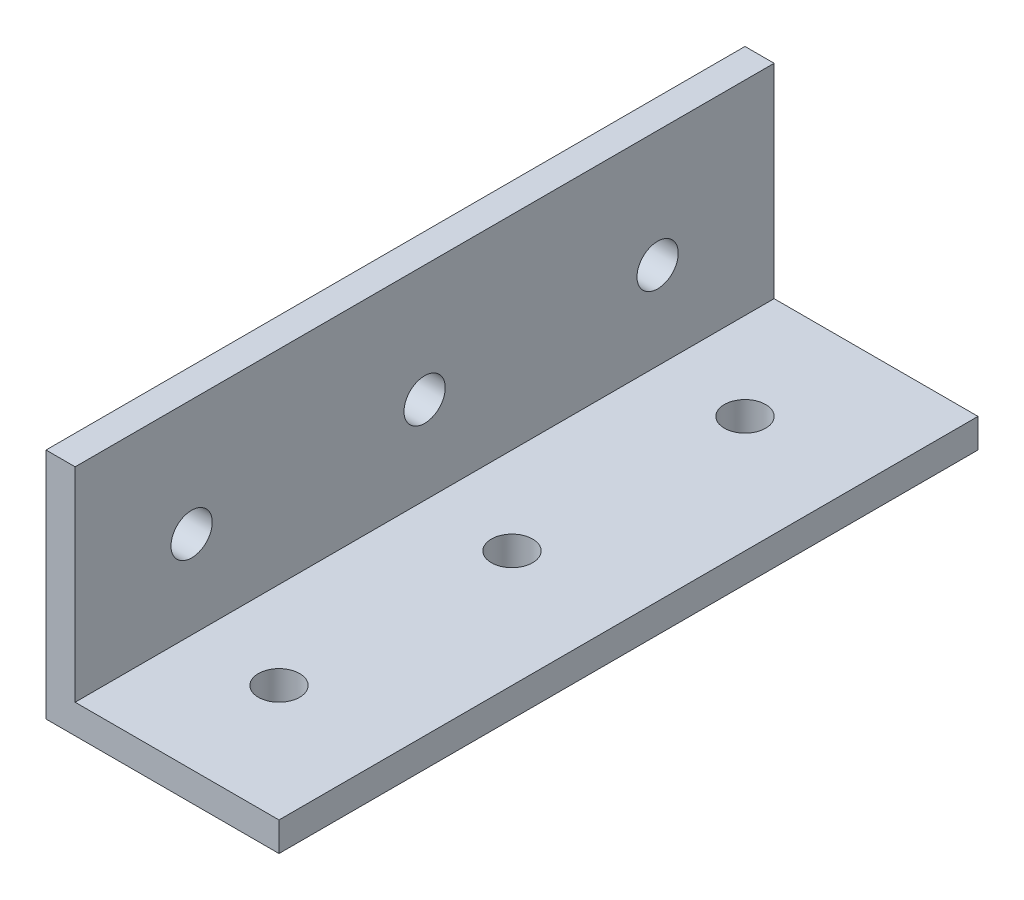
ISO-10303-21;
HEADER;
FILE_DESCRIPTION(('STEP AP214'),'2;1');
FILE_NAME('part.step','',(''),(''),'','','');
FILE_SCHEMA(('AUTOMOTIVE_DESIGN { 1 0 10303 214 1 1 1 1 }'));
ENDSEC;
DATA;
#1=APPLICATION_CONTEXT('core data for automotive mechanical design processes');
#2=APPLICATION_PROTOCOL_DEFINITION('international standard','automotive_design',2000,#1);
#3=PRODUCT_CONTEXT('',#1,'mechanical');
#4=PRODUCT('Part','Part','',(#3));
#5=PRODUCT_RELATED_PRODUCT_CATEGORY('part','',(#4));
#6=PRODUCT_DEFINITION_FORMATION('','',#4);
#7=PRODUCT_DEFINITION_CONTEXT('part definition',#1,'design');
#8=PRODUCT_DEFINITION('design','',#6,#7);
#9=PRODUCT_DEFINITION_SHAPE('','',#8);
#10=(LENGTH_UNIT() NAMED_UNIT(*) SI_UNIT(.MILLI.,.METRE.));
#11=(NAMED_UNIT(*) PLANE_ANGLE_UNIT() SI_UNIT($,.RADIAN.));
#12=(NAMED_UNIT(*) SI_UNIT($,.STERADIAN.) SOLID_ANGLE_UNIT());
#13=UNCERTAINTY_MEASURE_WITH_UNIT(LENGTH_MEASURE(1.E-05),#10,'distance_accuracy_value','');
#14=(GEOMETRIC_REPRESENTATION_CONTEXT(3) GLOBAL_UNCERTAINTY_ASSIGNED_CONTEXT((#13)) GLOBAL_UNIT_ASSIGNED_CONTEXT((#10,
#11,#12)) REPRESENTATION_CONTEXT('',''));
#15=CARTESIAN_POINT('',(0.,0.,0.));
#16=DIRECTION('',(0.,0.,1.));
#17=DIRECTION('',(1.,0.,0.));
#18=AXIS2_PLACEMENT_3D('',#15,#16,#17);
#19=CARTESIAN_POINT('',(0.,0.,76.2));
#20=DIRECTION('',(1.,0.,0.));
#21=DIRECTION('',(0.,0.,-1.));
#22=AXIS2_PLACEMENT_3D('',#19,#20,#21);
#23=PLANE('',#22);
#24=CARTESIAN_POINT('',(0.,12.7,63.5));
#25=DIRECTION('',(-1.,0.,0.));
#26=DIRECTION('',(0.,0.,1.));
#27=AXIS2_PLACEMENT_3D('',#24,#25,#26);
#28=CIRCLE('',#27,2.24789999999999);
#29=CARTESIAN_POINT('',(0.,12.7,65.7479));
#30=VERTEX_POINT('',#29);
#31=EDGE_CURVE('E159',#30,#30,#28,.T.);
#32=ORIENTED_EDGE('',*,*,#31,.F.);
#33=EDGE_LOOP('',(#32));
#34=FACE_BOUND('',#33,.T.);
#35=CARTESIAN_POINT('',(0.,12.7,38.1));
#36=DIRECTION('',(-1.,0.,0.));
#37=DIRECTION('',(0.,0.,1.));
#38=AXIS2_PLACEMENT_3D('',#35,#36,#37);
#39=CIRCLE('',#38,2.24789999999999);
#40=CARTESIAN_POINT('',(0.,12.7,40.3479));
#41=VERTEX_POINT('',#40);
#42=EDGE_CURVE('E148',#41,#41,#39,.T.);
#43=ORIENTED_EDGE('',*,*,#42,.F.);
#44=EDGE_LOOP('',(#43));
#45=FACE_BOUND('',#44,.T.);
#46=CARTESIAN_POINT('',(0.,12.7,12.7));
#47=DIRECTION('',(-1.,0.,0.));
#48=DIRECTION('',(0.,0.,1.));
#49=AXIS2_PLACEMENT_3D('',#46,#47,#48);
#50=CIRCLE('',#49,2.24789999999999);
#51=CARTESIAN_POINT('',(0.,12.7,14.9479));
#52=VERTEX_POINT('',#51);
#53=EDGE_CURVE('E147',#52,#52,#50,.T.);
#54=ORIENTED_EDGE('',*,*,#53,.F.);
#55=EDGE_LOOP('',(#54));
#56=FACE_BOUND('',#55,.T.);
#57=DIRECTION('',(0.,-1.,0.));
#58=VECTOR('',#57,1.);
#59=CARTESIAN_POINT('',(0.,0.,0.));
#60=LINE('',#59,#58);
#61=CARTESIAN_POINT('',(0.,25.4,0.));
#62=VERTEX_POINT('',#61);
#63=CARTESIAN_POINT('',(0.,0.,0.));
#64=VERTEX_POINT('',#63);
#65=EDGE_CURVE('E118',#62,#64,#60,.T.);
#66=ORIENTED_EDGE('',*,*,#65,.T.);
#67=DIRECTION('',(0.,0.,-1.));
#68=VECTOR('',#67,1.);
#69=CARTESIAN_POINT('',(0.,0.,76.2));
#70=LINE('',#69,#68);
#71=CARTESIAN_POINT('',(0.,0.,76.2));
#72=VERTEX_POINT('',#71);
#73=EDGE_CURVE('E11',#72,#64,#70,.T.);
#74=ORIENTED_EDGE('',*,*,#73,.F.);
#75=DIRECTION('',(0.,-1.,0.));
#76=VECTOR('',#75,1.);
#77=CARTESIAN_POINT('',(0.,0.,76.2));
#78=LINE('',#77,#76);
#79=CARTESIAN_POINT('',(0.,25.4,76.2));
#80=VERTEX_POINT('',#79);
#81=EDGE_CURVE('E129',#80,#72,#78,.T.);
#82=ORIENTED_EDGE('',*,*,#81,.F.);
#83=DIRECTION('',(0.,0.,-1.));
#84=VECTOR('',#83,1.);
#85=CARTESIAN_POINT('',(0.,25.4,76.2));
#86=LINE('',#85,#84);
#87=EDGE_CURVE('E114',#80,#62,#86,.T.);
#88=ORIENTED_EDGE('',*,*,#87,.T.);
#89=EDGE_LOOP('',(#66,#74,#82,#88));
#90=FACE_BOUND('',#89,.T.);
#91=ADVANCED_FACE('F32',(#34,#45,#56,#90),#23,.F.);
#92=CARTESIAN_POINT('',(0.,0.,76.2));
#93=DIRECTION('',(0.,1.,0.));
#94=DIRECTION('',(0.,0.,1.));
#95=AXIS2_PLACEMENT_3D('',#92,#93,#94);
#96=PLANE('',#95);
#97=CARTESIAN_POINT('',(12.7,0.,63.5));
#98=DIRECTION('',(0.,-1.,0.));
#99=DIRECTION('',(0.,0.,-1.));
#100=AXIS2_PLACEMENT_3D('',#97,#98,#99);
#101=CIRCLE('',#100,2.24789999999999);
#102=CARTESIAN_POINT('',(12.7,0.,61.2521));
#103=VERTEX_POINT('',#102);
#104=EDGE_CURVE('E144',#103,#103,#101,.T.);
#105=ORIENTED_EDGE('',*,*,#104,.F.);
#106=EDGE_LOOP('',(#105));
#107=FACE_BOUND('',#106,.T.);
#108=CARTESIAN_POINT('',(12.7,0.,38.1));
#109=DIRECTION('',(0.,-1.,0.));
#110=DIRECTION('',(0.,0.,-1.));
#111=AXIS2_PLACEMENT_3D('',#108,#109,#110);
#112=CIRCLE('',#111,2.24789999999999);
#113=CARTESIAN_POINT('',(12.7,0.,35.8521));
#114=VERTEX_POINT('',#113);
#115=EDGE_CURVE('E141',#114,#114,#112,.T.);
#116=ORIENTED_EDGE('',*,*,#115,.F.);
#117=EDGE_LOOP('',(#116));
#118=FACE_BOUND('',#117,.T.);
#119=CARTESIAN_POINT('',(12.7,0.,12.7));
#120=DIRECTION('',(0.,-1.,0.));
#121=DIRECTION('',(0.,0.,-1.));
#122=AXIS2_PLACEMENT_3D('',#119,#120,#121);
#123=CIRCLE('',#122,2.24789999999999);
#124=CARTESIAN_POINT('',(12.7,0.,10.4521));
#125=VERTEX_POINT('',#124);
#126=EDGE_CURVE('E137',#125,#125,#123,.T.);
#127=ORIENTED_EDGE('',*,*,#126,.F.);
#128=EDGE_LOOP('',(#127));
#129=FACE_BOUND('',#128,.T.);
#130=DIRECTION('',(1.,0.,0.));
#131=VECTOR('',#130,1.);
#132=CARTESIAN_POINT('',(0.,0.,0.));
#133=LINE('',#132,#131);
#134=CARTESIAN_POINT('',(25.4,0.,0.));
#135=VERTEX_POINT('',#134);
#136=EDGE_CURVE('E121',#64,#135,#133,.T.);
#137=ORIENTED_EDGE('',*,*,#136,.T.);
#138=DIRECTION('',(0.,0.,-1.));
#139=VECTOR('',#138,1.);
#140=CARTESIAN_POINT('',(25.4,0.,76.2));
#141=LINE('',#140,#139);
#142=CARTESIAN_POINT('',(25.4,0.,76.2));
#143=VERTEX_POINT('',#142);
#144=EDGE_CURVE('E41',#143,#135,#141,.T.);
#145=ORIENTED_EDGE('',*,*,#144,.F.);
#146=DIRECTION('',(1.,0.,0.));
#147=VECTOR('',#146,1.);
#148=CARTESIAN_POINT('',(0.,0.,76.2));
#149=LINE('',#148,#147);
#150=EDGE_CURVE('E87',#72,#143,#149,.T.);
#151=ORIENTED_EDGE('',*,*,#150,.F.);
#152=ORIENTED_EDGE('',*,*,#73,.T.);
#153=EDGE_LOOP('',(#137,#145,#151,#152));
#154=FACE_BOUND('',#153,.T.);
#155=ADVANCED_FACE('F173',(#107,#118,#129,#154),#96,.F.);
#156=CARTESIAN_POINT('',(25.4,0.,76.2));
#157=DIRECTION('',(-1.,0.,0.));
#158=DIRECTION('',(0.,0.,1.));
#159=AXIS2_PLACEMENT_3D('',#156,#157,#158);
#160=PLANE('',#159);
#161=DIRECTION('',(0.,1.,0.));
#162=VECTOR('',#161,1.);
#163=CARTESIAN_POINT('',(25.4,0.,0.));
#164=LINE('',#163,#162);
#165=CARTESIAN_POINT('',(25.4,3.175,0.));
#166=VERTEX_POINT('',#165);
#167=EDGE_CURVE('E124',#135,#166,#164,.T.);
#168=ORIENTED_EDGE('',*,*,#167,.T.);
#169=DIRECTION('',(0.,0.,-1.));
#170=VECTOR('',#169,1.);
#171=CARTESIAN_POINT('',(25.4,3.175,76.2));
#172=LINE('',#171,#170);
#173=CARTESIAN_POINT('',(25.4,3.175,76.2));
#174=VERTEX_POINT('',#173);
#175=EDGE_CURVE('E109',#174,#166,#172,.T.);
#176=ORIENTED_EDGE('',*,*,#175,.F.);
#177=DIRECTION('',(0.,1.,0.));
#178=VECTOR('',#177,1.);
#179=CARTESIAN_POINT('',(25.4,0.,76.2));
#180=LINE('',#179,#178);
#181=EDGE_CURVE('E100',#143,#174,#180,.T.);
#182=ORIENTED_EDGE('',*,*,#181,.F.);
#183=ORIENTED_EDGE('',*,*,#144,.T.);
#184=EDGE_LOOP('',(#168,#176,#182,#183));
#185=FACE_BOUND('',#184,.T.);
#186=ADVANCED_FACE('F176',(#185),#160,.F.);
#187=CARTESIAN_POINT('',(25.4,3.175,76.2));
#188=DIRECTION('',(0.,-1.,0.));
#189=DIRECTION('',(1.,0.,0.));
#190=AXIS2_PLACEMENT_3D('',#187,#188,#189);
#191=PLANE('',#190);
#192=CARTESIAN_POINT('',(12.7,3.175,63.5));
#193=DIRECTION('',(0.,-1.,0.));
#194=DIRECTION('',(1.,0.,0.));
#195=AXIS2_PLACEMENT_3D('',#192,#193,#194);
#196=CIRCLE('',#195,2.24789999999999);
#197=CARTESIAN_POINT('',(14.9479,3.175,63.5));
#198=VERTEX_POINT('',#197);
#199=EDGE_CURVE('E142',#198,#198,#196,.T.);
#200=ORIENTED_EDGE('',*,*,#199,.T.);
#201=EDGE_LOOP('',(#200));
#202=FACE_BOUND('',#201,.T.);
#203=CARTESIAN_POINT('',(12.7,3.175,38.1));
#204=DIRECTION('',(0.,-1.,0.));
#205=DIRECTION('',(1.,0.,0.));
#206=AXIS2_PLACEMENT_3D('',#203,#204,#205);
#207=CIRCLE('',#206,2.24789999999999);
#208=CARTESIAN_POINT('',(14.9479,3.175,38.1));
#209=VERTEX_POINT('',#208);
#210=EDGE_CURVE('E138',#209,#209,#207,.T.);
#211=ORIENTED_EDGE('',*,*,#210,.T.);
#212=EDGE_LOOP('',(#211));
#213=FACE_BOUND('',#212,.T.);
#214=CARTESIAN_POINT('',(12.7,3.175,12.7));
#215=DIRECTION('',(0.,-1.,0.));
#216=DIRECTION('',(1.,0.,0.));
#217=AXIS2_PLACEMENT_3D('',#214,#215,#216);
#218=CIRCLE('',#217,2.24789999999999);
#219=CARTESIAN_POINT('',(14.9479,3.175,12.7));
#220=VERTEX_POINT('',#219);
#221=EDGE_CURVE('E122',#220,#220,#218,.T.);
#222=ORIENTED_EDGE('',*,*,#221,.T.);
#223=EDGE_LOOP('',(#222));
#224=FACE_BOUND('',#223,.T.);
#225=DIRECTION('',(-1.,0.,0.));
#226=VECTOR('',#225,1.);
#227=CARTESIAN_POINT('',(25.4,3.175,0.));
#228=LINE('',#227,#226);
#229=CARTESIAN_POINT('',(3.175,3.175,0.));
#230=VERTEX_POINT('',#229);
#231=EDGE_CURVE('E108',#166,#230,#228,.T.);
#232=ORIENTED_EDGE('',*,*,#231,.T.);
#233=DIRECTION('',(0.,0.,-1.));
#234=VECTOR('',#233,1.);
#235=CARTESIAN_POINT('',(3.175,3.175,76.2));
#236=LINE('',#235,#234);
#237=CARTESIAN_POINT('',(3.175,3.175,76.2));
#238=VERTEX_POINT('',#237);
#239=EDGE_CURVE('E105',#238,#230,#236,.T.);
#240=ORIENTED_EDGE('',*,*,#239,.F.);
#241=DIRECTION('',(-1.,0.,0.));
#242=VECTOR('',#241,1.);
#243=CARTESIAN_POINT('',(25.4,3.175,76.2));
#244=LINE('',#243,#242);
#245=EDGE_CURVE('E94',#174,#238,#244,.T.);
#246=ORIENTED_EDGE('',*,*,#245,.F.);
#247=ORIENTED_EDGE('',*,*,#175,.T.);
#248=EDGE_LOOP('',(#232,#240,#246,#247));
#249=FACE_BOUND('',#248,.T.);
#250=ADVANCED_FACE('F106',(#202,#213,#224,#249),#191,.F.);
#251=CARTESIAN_POINT('',(3.175,25.4,76.2));
#252=DIRECTION('',(-1.,0.,0.));
#253=DIRECTION('',(0.,-1.,0.));
#254=AXIS2_PLACEMENT_3D('',#251,#252,#253);
#255=PLANE('',#254);
#256=CARTESIAN_POINT('',(3.175,12.7,63.5));
#257=DIRECTION('',(-1.,0.,0.));
#258=DIRECTION('',(0.,-1.,0.));
#259=AXIS2_PLACEMENT_3D('',#256,#257,#258);
#260=CIRCLE('',#259,2.24789999999999);
#261=CARTESIAN_POINT('',(3.175,10.4521,63.5));
#262=VERTEX_POINT('',#261);
#263=EDGE_CURVE('E35',#262,#262,#260,.T.);
#264=ORIENTED_EDGE('',*,*,#263,.T.);
#265=EDGE_LOOP('',(#264));
#266=FACE_BOUND('',#265,.T.);
#267=CARTESIAN_POINT('',(3.175,12.7,38.1));
#268=DIRECTION('',(-1.,0.,0.));
#269=DIRECTION('',(0.,-1.,0.));
#270=AXIS2_PLACEMENT_3D('',#267,#268,#269);
#271=CIRCLE('',#270,2.24789999999999);
#272=CARTESIAN_POINT('',(3.175,10.4521,38.1));
#273=VERTEX_POINT('',#272);
#274=EDGE_CURVE('E145',#273,#273,#271,.T.);
#275=ORIENTED_EDGE('',*,*,#274,.T.);
#276=EDGE_LOOP('',(#275));
#277=FACE_BOUND('',#276,.T.);
#278=CARTESIAN_POINT('',(3.175,12.7,12.7));
#279=DIRECTION('',(-1.,0.,0.));
#280=DIRECTION('',(0.,-1.,0.));
#281=AXIS2_PLACEMENT_3D('',#278,#279,#280);
#282=CIRCLE('',#281,2.24789999999999);
#283=CARTESIAN_POINT('',(3.175,10.4521,12.7));
#284=VERTEX_POINT('',#283);
#285=EDGE_CURVE('E152',#284,#284,#282,.T.);
#286=ORIENTED_EDGE('',*,*,#285,.T.);
#287=EDGE_LOOP('',(#286));
#288=FACE_BOUND('',#287,.T.);
#289=DIRECTION('',(0.,1.,0.));
#290=VECTOR('',#289,1.);
#291=CARTESIAN_POINT('',(3.175,25.4,0.));
#292=LINE('',#291,#290);
#293=CARTESIAN_POINT('',(3.175,25.4,0.));
#294=VERTEX_POINT('',#293);
#295=EDGE_CURVE('E73',#230,#294,#292,.T.);
#296=ORIENTED_EDGE('',*,*,#295,.T.);
#297=DIRECTION('',(0.,0.,-1.));
#298=VECTOR('',#297,1.);
#299=CARTESIAN_POINT('',(3.175,25.4,76.2));
#300=LINE('',#299,#298);
#301=CARTESIAN_POINT('',(3.175,25.4,76.2));
#302=VERTEX_POINT('',#301);
#303=EDGE_CURVE('E110',#302,#294,#300,.T.);
#304=ORIENTED_EDGE('',*,*,#303,.F.);
#305=DIRECTION('',(0.,1.,0.));
#306=VECTOR('',#305,1.);
#307=CARTESIAN_POINT('',(3.175,25.4,76.2));
#308=LINE('',#307,#306);
#309=EDGE_CURVE('E98',#238,#302,#308,.T.);
#310=ORIENTED_EDGE('',*,*,#309,.F.);
#311=ORIENTED_EDGE('',*,*,#239,.T.);
#312=EDGE_LOOP('',(#296,#304,#310,#311));
#313=FACE_BOUND('',#312,.T.);
#314=ADVANCED_FACE('F112',(#266,#277,#288,#313),#255,.F.);
#315=CARTESIAN_POINT('',(0.,25.4,76.2));
#316=DIRECTION('',(0.,-1.,0.));
#317=DIRECTION('',(0.,0.,-1.));
#318=AXIS2_PLACEMENT_3D('',#315,#316,#317);
#319=PLANE('',#318);
#320=DIRECTION('',(-1.,0.,0.));
#321=VECTOR('',#320,1.);
#322=CARTESIAN_POINT('',(0.,25.4,0.));
#323=LINE('',#322,#321);
#324=EDGE_CURVE('E79',#294,#62,#323,.T.);
#325=ORIENTED_EDGE('',*,*,#324,.T.);
#326=ORIENTED_EDGE('',*,*,#87,.F.);
#327=DIRECTION('',(-1.,0.,0.));
#328=VECTOR('',#327,1.);
#329=CARTESIAN_POINT('',(0.,25.4,76.2));
#330=LINE('',#329,#328);
#331=EDGE_CURVE('E50',#302,#80,#330,.T.);
#332=ORIENTED_EDGE('',*,*,#331,.F.);
#333=ORIENTED_EDGE('',*,*,#303,.T.);
#334=EDGE_LOOP('',(#325,#326,#332,#333));
#335=FACE_BOUND('',#334,.T.);
#336=ADVANCED_FACE('F181',(#335),#319,.F.);
#337=CARTESIAN_POINT('',(0.,0.,76.2));
#338=DIRECTION('',(0.,0.,-1.));
#339=DIRECTION('',(-1.,0.,0.));
#340=AXIS2_PLACEMENT_3D('',#337,#338,#339);
#341=PLANE('',#340);
#342=ORIENTED_EDGE('',*,*,#81,.T.);
#343=ORIENTED_EDGE('',*,*,#150,.T.);
#344=ORIENTED_EDGE('',*,*,#181,.T.);
#345=ORIENTED_EDGE('',*,*,#245,.T.);
#346=ORIENTED_EDGE('',*,*,#309,.T.);
#347=ORIENTED_EDGE('',*,*,#331,.T.);
#348=EDGE_LOOP('',(#342,#343,#344,#345,#346,#347));
#349=FACE_BOUND('',#348,.T.);
#350=ADVANCED_FACE('F96',(#349),#341,.F.);
#351=CARTESIAN_POINT('',(0.,0.,0.));
#352=DIRECTION('',(0.,0.,-1.));
#353=DIRECTION('',(-1.,0.,0.));
#354=AXIS2_PLACEMENT_3D('',#351,#352,#353);
#355=PLANE('',#354);
#356=ORIENTED_EDGE('',*,*,#65,.F.);
#357=ORIENTED_EDGE('',*,*,#324,.F.);
#358=ORIENTED_EDGE('',*,*,#295,.F.);
#359=ORIENTED_EDGE('',*,*,#231,.F.);
#360=ORIENTED_EDGE('',*,*,#167,.F.);
#361=ORIENTED_EDGE('',*,*,#136,.F.);
#362=EDGE_LOOP('',(#356,#357,#358,#359,#360,#361));
#363=FACE_BOUND('',#362,.T.);
#364=ADVANCED_FACE('F179',(#363),#355,.T.);
#365=CARTESIAN_POINT('',(12.7,0.,12.7));
#366=DIRECTION('',(0.,-1.,0.));
#367=DIRECTION('',(0.,0.,-1.));
#368=AXIS2_PLACEMENT_3D('',#365,#366,#367);
#369=CYLINDRICAL_SURFACE('',#368,2.24789999999999);
#370=ORIENTED_EDGE('',*,*,#126,.T.);
#371=EDGE_LOOP('',(#370));
#372=FACE_BOUND('',#371,.T.);
#373=ORIENTED_EDGE('',*,*,#221,.F.);
#374=EDGE_LOOP('',(#373));
#375=FACE_BOUND('',#374,.T.);
#376=ADVANCED_FACE('F225',(#372,#375),#369,.F.);
#377=CARTESIAN_POINT('',(12.7,0.,38.1));
#378=DIRECTION('',(0.,-1.,0.));
#379=DIRECTION('',(0.,0.,-1.));
#380=AXIS2_PLACEMENT_3D('',#377,#378,#379);
#381=CYLINDRICAL_SURFACE('',#380,2.24789999999999);
#382=ORIENTED_EDGE('',*,*,#115,.T.);
#383=EDGE_LOOP('',(#382));
#384=FACE_BOUND('',#383,.T.);
#385=ORIENTED_EDGE('',*,*,#210,.F.);
#386=EDGE_LOOP('',(#385));
#387=FACE_BOUND('',#386,.T.);
#388=ADVANCED_FACE('F218',(#384,#387),#381,.F.);
#389=CARTESIAN_POINT('',(12.7,0.,63.5));
#390=DIRECTION('',(0.,-1.,0.));
#391=DIRECTION('',(0.,0.,-1.));
#392=AXIS2_PLACEMENT_3D('',#389,#390,#391);
#393=CYLINDRICAL_SURFACE('',#392,2.24789999999999);
#394=ORIENTED_EDGE('',*,*,#104,.T.);
#395=EDGE_LOOP('',(#394));
#396=FACE_BOUND('',#395,.T.);
#397=ORIENTED_EDGE('',*,*,#199,.F.);
#398=EDGE_LOOP('',(#397));
#399=FACE_BOUND('',#398,.T.);
#400=ADVANCED_FACE('F208',(#396,#399),#393,.F.);
#401=CARTESIAN_POINT('',(0.,12.7,12.7));
#402=DIRECTION('',(-1.,0.,0.));
#403=DIRECTION('',(0.,0.,1.));
#404=AXIS2_PLACEMENT_3D('',#401,#402,#403);
#405=CYLINDRICAL_SURFACE('',#404,2.24789999999999);
#406=ORIENTED_EDGE('',*,*,#53,.T.);
#407=EDGE_LOOP('',(#406));
#408=FACE_BOUND('',#407,.T.);
#409=ORIENTED_EDGE('',*,*,#285,.F.);
#410=EDGE_LOOP('',(#409));
#411=FACE_BOUND('',#410,.T.);
#412=ADVANCED_FACE('F204',(#408,#411),#405,.F.);
#413=CARTESIAN_POINT('',(0.,12.7,38.1));
#414=DIRECTION('',(-1.,0.,0.));
#415=DIRECTION('',(0.,0.,1.));
#416=AXIS2_PLACEMENT_3D('',#413,#414,#415);
#417=CYLINDRICAL_SURFACE('',#416,2.24789999999999);
#418=ORIENTED_EDGE('',*,*,#42,.T.);
#419=EDGE_LOOP('',(#418));
#420=FACE_BOUND('',#419,.T.);
#421=ORIENTED_EDGE('',*,*,#274,.F.);
#422=EDGE_LOOP('',(#421));
#423=FACE_BOUND('',#422,.T.);
#424=ADVANCED_FACE('F207',(#420,#423),#417,.F.);
#425=CARTESIAN_POINT('',(0.,12.7,63.5));
#426=DIRECTION('',(-1.,0.,0.));
#427=DIRECTION('',(0.,0.,1.));
#428=AXIS2_PLACEMENT_3D('',#425,#426,#427);
#429=CYLINDRICAL_SURFACE('',#428,2.24789999999999);
#430=ORIENTED_EDGE('',*,*,#31,.T.);
#431=EDGE_LOOP('',(#430));
#432=FACE_BOUND('',#431,.T.);
#433=ORIENTED_EDGE('',*,*,#263,.F.);
#434=EDGE_LOOP('',(#433));
#435=FACE_BOUND('',#434,.T.);
#436=ADVANCED_FACE('F216',(#432,#435),#429,.F.);
#437=CLOSED_SHELL('',(#91,#155,#186,#250,#314,#336,#350,#364,#376,#388,#400,#412,#424,#436));
#438=MANIFOLD_SOLID_BREP('B2',#437);
#439=ADVANCED_BREP_SHAPE_REPRESENTATION('',(#18,#438),#14);
#440=SHAPE_DEFINITION_REPRESENTATION(#9,#439);
ENDSEC;
END-ISO-10303-21;
